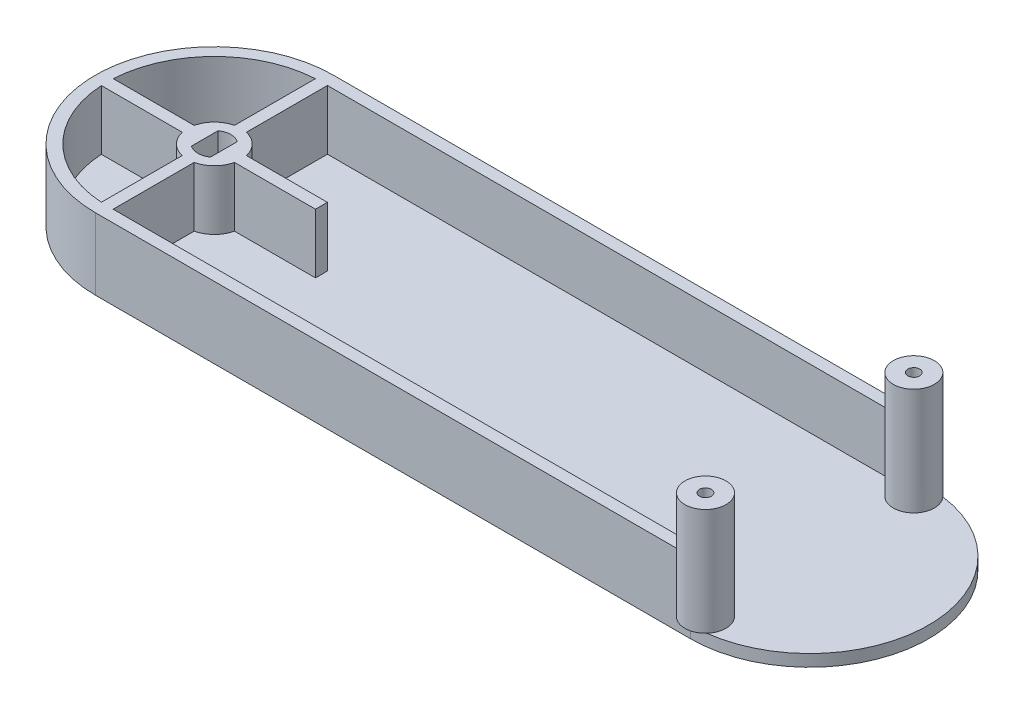
ISO-10303-21;
HEADER;
FILE_DESCRIPTION(('STEP AP214'),'2;1');
FILE_NAME('part.step','',(''),(''),'','','');
FILE_SCHEMA(('AUTOMOTIVE_DESIGN { 1 0 10303 214 1 1 1 1 }'));
ENDSEC;
DATA;
#1=APPLICATION_CONTEXT('core data for automotive mechanical design processes');
#2=APPLICATION_PROTOCOL_DEFINITION('international standard','automotive_design',2000,#1);
#3=PRODUCT_CONTEXT('',#1,'mechanical');
#4=PRODUCT('Part','Part','',(#3));
#5=PRODUCT_RELATED_PRODUCT_CATEGORY('part','',(#4));
#6=PRODUCT_DEFINITION_FORMATION('','',#4);
#7=PRODUCT_DEFINITION_CONTEXT('part definition',#1,'design');
#8=PRODUCT_DEFINITION('design','',#6,#7);
#9=PRODUCT_DEFINITION_SHAPE('','',#8);
#10=(LENGTH_UNIT() NAMED_UNIT(*) SI_UNIT(.MILLI.,.METRE.));
#11=(NAMED_UNIT(*) PLANE_ANGLE_UNIT() SI_UNIT($,.RADIAN.));
#12=(NAMED_UNIT(*) SI_UNIT($,.STERADIAN.) SOLID_ANGLE_UNIT());
#13=UNCERTAINTY_MEASURE_WITH_UNIT(LENGTH_MEASURE(1.E-05),#10,'distance_accuracy_value','');
#14=(GEOMETRIC_REPRESENTATION_CONTEXT(3) GLOBAL_UNCERTAINTY_ASSIGNED_CONTEXT((#13)) GLOBAL_UNIT_ASSIGNED_CONTEXT((#10,
#11,#12)) REPRESENTATION_CONTEXT('',''));
#15=CARTESIAN_POINT('',(0.,0.,0.));
#16=DIRECTION('',(0.,0.,1.));
#17=DIRECTION('',(1.,0.,0.));
#18=AXIS2_PLACEMENT_3D('',#15,#16,#17);
#19=CARTESIAN_POINT('',(-50.,12.,20.));
#20=DIRECTION('',(0.,0.,-1.));
#21=DIRECTION('',(-1.,0.,0.));
#22=AXIS2_PLACEMENT_3D('',#19,#20,#21);
#23=PLANE('',#22);
#24=DIRECTION('',(1.,0.,0.));
#25=VECTOR('',#24,1.);
#26=CARTESIAN_POINT('',(-50.,2.,20.));
#27=LINE('',#26,#25);
#28=CARTESIAN_POINT('',(47.6225013144062,2.,20.));
#29=VERTEX_POINT('',#28);
#30=CARTESIAN_POINT('',(50.,2.,20.));
#31=VERTEX_POINT('',#30);
#32=EDGE_CURVE('E246',#29,#31,#27,.T.);
#33=ORIENTED_EDGE('',*,*,#32,.F.);
#34=DIRECTION('',(0.,-1.,0.));
#35=VECTOR('',#34,1.);
#36=CARTESIAN_POINT('',(47.6225013144062,20.,20.));
#37=LINE('',#36,#35);
#38=CARTESIAN_POINT('',(47.6225013144062,12.,20.));
#39=VERTEX_POINT('',#38);
#40=EDGE_CURVE('E253',#39,#29,#37,.T.);
#41=ORIENTED_EDGE('',*,*,#40,.F.);
#42=DIRECTION('',(1.,0.,0.));
#43=VECTOR('',#42,1.);
#44=CARTESIAN_POINT('',(-50.,12.,20.));
#45=LINE('',#44,#43);
#46=CARTESIAN_POINT('',(-50.,12.,20.));
#47=VERTEX_POINT('',#46);
#48=EDGE_CURVE('E422',#47,#39,#45,.T.);
#49=ORIENTED_EDGE('',*,*,#48,.F.);
#50=DIRECTION('',(0.,-1.,0.));
#51=VECTOR('',#50,1.);
#52=CARTESIAN_POINT('',(-50.,12.,20.));
#53=LINE('',#52,#51);
#54=CARTESIAN_POINT('',(-50.,0.,20.));
#55=VERTEX_POINT('',#54);
#56=EDGE_CURVE('E444',#47,#55,#53,.T.);
#57=ORIENTED_EDGE('',*,*,#56,.T.);
#58=DIRECTION('',(1.,0.,0.));
#59=VECTOR('',#58,1.);
#60=CARTESIAN_POINT('',(-50.,0.,20.));
#61=LINE('',#60,#59);
#62=CARTESIAN_POINT('',(50.,0.,20.));
#63=VERTEX_POINT('',#62);
#64=EDGE_CURVE('E431',#55,#63,#61,.T.);
#65=ORIENTED_EDGE('',*,*,#64,.T.);
#66=DIRECTION('',(0.,-1.,0.));
#67=VECTOR('',#66,1.);
#68=CARTESIAN_POINT('',(50.,12.,20.));
#69=LINE('',#68,#67);
#70=EDGE_CURVE('E442',#31,#63,#69,.T.);
#71=ORIENTED_EDGE('',*,*,#70,.F.);
#72=EDGE_LOOP('',(#33,#41,#49,#57,#65,#71));
#73=FACE_BOUND('',#72,.T.);
#74=ADVANCED_FACE('F51',(#73),#23,.F.);
#75=CARTESIAN_POINT('',(-50.,12.,18.));
#76=DIRECTION('',(0.,0.,-1.));
#77=DIRECTION('',(-1.,0.,0.));
#78=AXIS2_PLACEMENT_3D('',#75,#76,#77);
#79=PLANE('',#78);
#80=DIRECTION('',(1.,0.,0.));
#81=VECTOR('',#80,1.);
#82=CARTESIAN_POINT('',(-50.,12.,18.));
#83=LINE('',#82,#81);
#84=CARTESIAN_POINT('',(-49.,12.,18.));
#85=VERTEX_POINT('',#84);
#86=CARTESIAN_POINT('',(46.5864241622603,12.,18.));
#87=VERTEX_POINT('',#86);
#88=EDGE_CURVE('E413',#85,#87,#83,.T.);
#89=ORIENTED_EDGE('',*,*,#88,.T.);
#90=DIRECTION('',(0.,-1.,0.));
#91=VECTOR('',#90,1.);
#92=CARTESIAN_POINT('',(46.5864241622603,20.,18.));
#93=LINE('',#92,#91);
#94=CARTESIAN_POINT('',(46.5864241622603,2.,18.));
#95=VERTEX_POINT('',#94);
#96=EDGE_CURVE('E12',#87,#95,#93,.T.);
#97=ORIENTED_EDGE('',*,*,#96,.T.);
#98=DIRECTION('',(1.,0.,0.));
#99=VECTOR('',#98,1.);
#100=CARTESIAN_POINT('',(-50.,2.,18.));
#101=LINE('',#100,#99);
#102=CARTESIAN_POINT('',(-48.9999999999999,2.,18.));
#103=VERTEX_POINT('',#102);
#104=EDGE_CURVE('E259',#103,#95,#101,.T.);
#105=ORIENTED_EDGE('',*,*,#104,.F.);
#106=DIRECTION('',(0.,-1.,0.));
#107=VECTOR('',#106,1.);
#108=CARTESIAN_POINT('',(-49.,12.,18.));
#109=LINE('',#108,#107);
#110=EDGE_CURVE('E311',#85,#103,#109,.T.);
#111=ORIENTED_EDGE('',*,*,#110,.F.);
#112=EDGE_LOOP('',(#89,#97,#105,#111));
#113=FACE_BOUND('',#112,.T.);
#114=ADVANCED_FACE('F547',(#113),#79,.T.);
#115=CARTESIAN_POINT('',(50.,12.,0.));
#116=DIRECTION('',(0.,-1.,0.));
#117=DIRECTION('',(0.,0.,-1.));
#118=AXIS2_PLACEMENT_3D('',#115,#116,#117);
#119=CYLINDRICAL_SURFACE('',#118,20.);
#120=CARTESIAN_POINT('',(50.,2.,0.));
#121=DIRECTION('',(0.,1.,0.));
#122=DIRECTION('',(0.,0.,1.));
#123=AXIS2_PLACEMENT_3D('',#120,#121,#122);
#124=CIRCLE('',#123,20.);
#125=CARTESIAN_POINT('',(52.5365168538766,2.,19.8385));
#126=VERTEX_POINT('',#125);
#127=EDGE_CURVE('E242',#31,#126,#124,.T.);
#128=ORIENTED_EDGE('',*,*,#127,.F.);
#129=ORIENTED_EDGE('',*,*,#70,.T.);
#130=CARTESIAN_POINT('',(50.,0.,0.));
#131=DIRECTION('',(0.,1.,0.));
#132=DIRECTION('',(0.,0.,1.));
#133=AXIS2_PLACEMENT_3D('',#130,#131,#132);
#134=CIRCLE('',#133,20.);
#135=CARTESIAN_POINT('',(50.,0.,-20.));
#136=VERTEX_POINT('',#135);
#137=EDGE_CURVE('E434',#63,#136,#134,.T.);
#138=ORIENTED_EDGE('',*,*,#137,.T.);
#139=DIRECTION('',(0.,-1.,0.));
#140=VECTOR('',#139,1.);
#141=CARTESIAN_POINT('',(50.,12.,-20.));
#142=LINE('',#141,#140);
#143=CARTESIAN_POINT('',(50.,2.,-20.));
#144=VERTEX_POINT('',#143);
#145=EDGE_CURVE('E440',#144,#136,#142,.T.);
#146=ORIENTED_EDGE('',*,*,#145,.F.);
#147=CARTESIAN_POINT('',(50.,2.,0.));
#148=DIRECTION('',(0.,-1.,0.));
#149=DIRECTION('',(0.,0.,-1.));
#150=AXIS2_PLACEMENT_3D('',#147,#148,#149);
#151=CIRCLE('',#150,20.);
#152=CARTESIAN_POINT('',(52.5365168538766,2.,-19.8385));
#153=VERTEX_POINT('',#152);
#154=EDGE_CURVE('E264',#144,#153,#151,.T.);
#155=ORIENTED_EDGE('',*,*,#154,.T.);
#156=EDGE_CURVE('E72',#126,#153,#124,.T.);
#157=ORIENTED_EDGE('',*,*,#156,.F.);
#158=EDGE_LOOP('',(#128,#129,#138,#146,#155,#157));
#159=FACE_BOUND('',#158,.T.);
#160=ADVANCED_FACE('F261',(#159),#119,.T.);
#161=CARTESIAN_POINT('',(-50.,2.,0.));
#162=DIRECTION('',(0.,1.,0.));
#163=DIRECTION('',(0.,0.,1.));
#164=AXIS2_PLACEMENT_3D('',#161,#162,#163);
#165=PLANE('',#164);
#166=CARTESIAN_POINT('',(-50.,2.,0.));
#167=DIRECTION('',(0.,1.,0.));
#168=DIRECTION('',(0.,0.,1.));
#169=AXIS2_PLACEMENT_3D('',#166,#167,#168);
#170=CIRCLE('',#169,18.);
#171=CARTESIAN_POINT('',(-51.,2.,-17.9722007556114));
#172=VERTEX_POINT('',#171);
#173=CARTESIAN_POINT('',(-67.9722007556114,2.,-1.00000000000015));
#174=VERTEX_POINT('',#173);
#175=EDGE_CURVE('E404',#172,#174,#170,.T.);
#176=ORIENTED_EDGE('',*,*,#175,.T.);
#177=DIRECTION('',(-1.,0.,0.));
#178=VECTOR('',#177,1.);
#179=CARTESIAN_POINT('',(0.,2.,-0.999999999999426));
#180=LINE('',#179,#178);
#181=CARTESIAN_POINT('',(-54.3874821936961,2.,-1.));
#182=VERTEX_POINT('',#181);
#183=EDGE_CURVE('E249',#182,#174,#180,.T.);
#184=ORIENTED_EDGE('',*,*,#183,.F.);
#185=CARTESIAN_POINT('',(-50.,2.,0.));
#186=DIRECTION('',(0.,1.,0.));
#187=DIRECTION('',(0.,0.,1.));
#188=AXIS2_PLACEMENT_3D('',#185,#186,#187);
#189=CIRCLE('',#188,4.5);
#190=CARTESIAN_POINT('',(-51.,2.,-4.38748219369606));
#191=VERTEX_POINT('',#190);
#192=EDGE_CURVE('E367',#191,#182,#189,.T.);
#193=ORIENTED_EDGE('',*,*,#192,.F.);
#194=DIRECTION('',(0.,0.,-1.));
#195=VECTOR('',#194,1.);
#196=CARTESIAN_POINT('',(-51.,2.,0.));
#197=LINE('',#196,#195);
#198=EDGE_CURVE('E346',#191,#172,#197,.T.);
#199=ORIENTED_EDGE('',*,*,#198,.T.);
#200=EDGE_LOOP('',(#176,#184,#193,#199));
#201=FACE_BOUND('',#200,.T.);
#202=ADVANCED_FACE('F554',(#201),#165,.T.);
#203=CARTESIAN_POINT('',(-50.,12.,0.));
#204=DIRECTION('',(0.,-1.,0.));
#205=DIRECTION('',(0.,0.,-1.));
#206=AXIS2_PLACEMENT_3D('',#203,#204,#205);
#207=CYLINDRICAL_SURFACE('',#206,4.5);
#208=DIRECTION('',(0.,-1.,0.));
#209=VECTOR('',#208,1.);
#210=CARTESIAN_POINT('',(-54.3874821936961,12.,-1.));
#211=LINE('',#210,#209);
#212=CARTESIAN_POINT('',(-54.3874821936961,12.,-1.));
#213=VERTEX_POINT('',#212);
#214=EDGE_CURVE('E289',#213,#182,#211,.T.);
#215=ORIENTED_EDGE('',*,*,#214,.F.);
#216=CARTESIAN_POINT('',(-50.,12.,0.));
#217=DIRECTION('',(0.,1.,0.));
#218=DIRECTION('',(0.,0.,1.));
#219=AXIS2_PLACEMENT_3D('',#216,#217,#218);
#220=CIRCLE('',#219,4.5);
#221=CARTESIAN_POINT('',(-51.,12.,-4.38748219369606));
#222=VERTEX_POINT('',#221);
#223=EDGE_CURVE('E374',#222,#213,#220,.T.);
#224=ORIENTED_EDGE('',*,*,#223,.F.);
#225=DIRECTION('',(0.,-1.,0.));
#226=VECTOR('',#225,1.);
#227=CARTESIAN_POINT('',(-51.,12.,-4.38748219369606));
#228=LINE('',#227,#226);
#229=EDGE_CURVE('E355',#222,#191,#228,.T.);
#230=ORIENTED_EDGE('',*,*,#229,.T.);
#231=ORIENTED_EDGE('',*,*,#192,.T.);
#232=EDGE_LOOP('',(#215,#224,#230,#231));
#233=FACE_BOUND('',#232,.T.);
#234=ADVANCED_FACE('F580',(#233),#207,.T.);
#235=CARTESIAN_POINT('',(-50.,12.,0.));
#236=DIRECTION('',(0.,-1.,0.));
#237=DIRECTION('',(0.,0.,-1.));
#238=AXIS2_PLACEMENT_3D('',#235,#236,#237);
#239=CYLINDRICAL_SURFACE('',#238,18.);
#240=CARTESIAN_POINT('',(-50.,12.,0.));
#241=DIRECTION('',(0.,1.,0.));
#242=DIRECTION('',(0.,0.,1.));
#243=AXIS2_PLACEMENT_3D('',#240,#241,#242);
#244=CIRCLE('',#243,18.);
#245=CARTESIAN_POINT('',(-51.,12.,-17.9722007556114));
#246=VERTEX_POINT('',#245);
#247=CARTESIAN_POINT('',(-67.9722007556114,12.,-1.00000000000015));
#248=VERTEX_POINT('',#247);
#249=EDGE_CURVE('E411',#246,#248,#244,.T.);
#250=ORIENTED_EDGE('',*,*,#249,.T.);
#251=DIRECTION('',(0.,-1.,0.));
#252=VECTOR('',#251,1.);
#253=CARTESIAN_POINT('',(-67.9722007556114,12.,-1.00000000000015));
#254=LINE('',#253,#252);
#255=EDGE_CURVE('E287',#248,#174,#254,.T.);
#256=ORIENTED_EDGE('',*,*,#255,.T.);
#257=ORIENTED_EDGE('',*,*,#175,.F.);
#258=DIRECTION('',(0.,-1.,0.));
#259=VECTOR('',#258,1.);
#260=CARTESIAN_POINT('',(-51.,12.,-17.9722007556114));
#261=LINE('',#260,#259);
#262=EDGE_CURVE('E361',#246,#172,#261,.T.);
#263=ORIENTED_EDGE('',*,*,#262,.F.);
#264=EDGE_LOOP('',(#250,#256,#257,#263));
#265=FACE_BOUND('',#264,.T.);
#266=ADVANCED_FACE('F586',(#265),#239,.F.);
#267=DIRECTION('',(-1.,0.,0.));
#268=VECTOR('',#267,1.);
#269=CARTESIAN_POINT('',(0.,2.,1.00000000000058));
#270=LINE('',#269,#268);
#271=CARTESIAN_POINT('',(-54.3874821936961,2.,1.));
#272=VERTEX_POINT('',#271);
#273=CARTESIAN_POINT('',(-67.9722007556114,2.,0.999999999999855));
#274=VERTEX_POINT('',#273);
#275=EDGE_CURVE('E276',#272,#274,#270,.T.);
#276=ORIENTED_EDGE('',*,*,#275,.T.);
#277=CARTESIAN_POINT('',(-51.,2.,17.9722007556114));
#278=VERTEX_POINT('',#277);
#279=EDGE_CURVE('E400',#274,#278,#170,.T.);
#280=ORIENTED_EDGE('',*,*,#279,.T.);
#281=DIRECTION('',(0.,0.,1.));
#282=VECTOR('',#281,1.);
#283=CARTESIAN_POINT('',(-50.9999999999999,2.,-3.60178889026383E-13));
#284=LINE('',#283,#282);
#285=CARTESIAN_POINT('',(-50.9999999999999,2.,4.38748219369608));
#286=VERTEX_POINT('',#285);
#287=EDGE_CURVE('E297',#286,#278,#284,.T.);
#288=ORIENTED_EDGE('',*,*,#287,.F.);
#289=EDGE_CURVE('E387',#272,#286,#189,.T.);
#290=ORIENTED_EDGE('',*,*,#289,.F.);
#291=EDGE_LOOP('',(#276,#280,#288,#290));
#292=FACE_BOUND('',#291,.T.);
#293=ADVANCED_FACE('F516',(#292),#165,.T.);
#294=CARTESIAN_POINT('',(-54.3874821936961,12.,0.999999999999999));
#295=VERTEX_POINT('',#294);
#296=CARTESIAN_POINT('',(-50.9999999999999,12.,4.38748219369608));
#297=VERTEX_POINT('',#296);
#298=EDGE_CURVE('E378',#295,#297,#220,.T.);
#299=ORIENTED_EDGE('',*,*,#298,.F.);
#300=DIRECTION('',(0.,-1.,0.));
#301=VECTOR('',#300,1.);
#302=CARTESIAN_POINT('',(-54.3874821936961,12.,0.999999999999999));
#303=LINE('',#302,#301);
#304=EDGE_CURVE('E279',#295,#272,#303,.T.);
#305=ORIENTED_EDGE('',*,*,#304,.T.);
#306=ORIENTED_EDGE('',*,*,#289,.T.);
#307=DIRECTION('',(0.,-1.,0.));
#308=VECTOR('',#307,1.);
#309=CARTESIAN_POINT('',(-50.9999999999999,12.,4.38748219369608));
#310=LINE('',#309,#308);
#311=EDGE_CURVE('E306',#297,#286,#310,.T.);
#312=ORIENTED_EDGE('',*,*,#311,.F.);
#313=EDGE_LOOP('',(#299,#305,#306,#312));
#314=FACE_BOUND('',#313,.T.);
#315=ADVANCED_FACE('F511',(#314),#207,.T.);
#316=DIRECTION('',(0.,-1.,0.));
#317=VECTOR('',#316,1.);
#318=CARTESIAN_POINT('',(-67.9722007556114,12.,0.999999999999855));
#319=LINE('',#318,#317);
#320=CARTESIAN_POINT('',(-67.9722007556114,12.,0.999999999999855));
#321=VERTEX_POINT('',#320);
#322=EDGE_CURVE('E284',#321,#274,#319,.T.);
#323=ORIENTED_EDGE('',*,*,#322,.F.);
#324=CARTESIAN_POINT('',(-51.,12.,17.9722007556114));
#325=VERTEX_POINT('',#324);
#326=EDGE_CURVE('E410',#321,#325,#244,.T.);
#327=ORIENTED_EDGE('',*,*,#326,.T.);
#328=DIRECTION('',(0.,-1.,0.));
#329=VECTOR('',#328,1.);
#330=CARTESIAN_POINT('',(-51.,12.,17.9722007556114));
#331=LINE('',#330,#329);
#332=EDGE_CURVE('E300',#325,#278,#331,.T.);
#333=ORIENTED_EDGE('',*,*,#332,.T.);
#334=ORIENTED_EDGE('',*,*,#279,.F.);
#335=EDGE_LOOP('',(#323,#327,#333,#334));
#336=FACE_BOUND('',#335,.T.);
#337=ADVANCED_FACE('F558',(#336),#239,.F.);
#338=ORIENTED_EDGE('',*,*,#104,.T.);
#339=CARTESIAN_POINT('',(50.,2.,17.5));
#340=DIRECTION('',(0.,1.,0.));
#341=DIRECTION('',(0.,0.,1.));
#342=AXIS2_PLACEMENT_3D('',#339,#340,#341);
#343=CIRCLE('',#342,3.45);
#344=EDGE_CURVE('E66',#126,#95,#343,.T.);
#345=ORIENTED_EDGE('',*,*,#344,.F.);
#346=ORIENTED_EDGE('',*,*,#156,.T.);
#347=CARTESIAN_POINT('',(50.,2.,-17.5));
#348=DIRECTION('',(0.,-1.,0.));
#349=DIRECTION('',(0.,0.,-1.));
#350=AXIS2_PLACEMENT_3D('',#347,#348,#349);
#351=CIRCLE('',#350,3.45);
#352=CARTESIAN_POINT('',(46.5864241622603,2.,-18.));
#353=VERTEX_POINT('',#352);
#354=EDGE_CURVE('E485',#153,#353,#351,.T.);
#355=ORIENTED_EDGE('',*,*,#354,.T.);
#356=DIRECTION('',(-1.,0.,0.));
#357=VECTOR('',#356,1.);
#358=CARTESIAN_POINT('',(-50.,2.,-18.));
#359=LINE('',#358,#357);
#360=CARTESIAN_POINT('',(-49.,2.,-18.));
#361=VERTEX_POINT('',#360);
#362=EDGE_CURVE('E408',#353,#361,#359,.T.);
#363=ORIENTED_EDGE('',*,*,#362,.T.);
#364=DIRECTION('',(0.,0.,-1.));
#365=VECTOR('',#364,1.);
#366=CARTESIAN_POINT('',(-49.,2.,0.));
#367=LINE('',#366,#365);
#368=CARTESIAN_POINT('',(-49.,2.,-4.38748219369606));
#369=VERTEX_POINT('',#368);
#370=EDGE_CURVE('E341',#369,#361,#367,.T.);
#371=ORIENTED_EDGE('',*,*,#370,.F.);
#372=CARTESIAN_POINT('',(-45.612517806304,2.,-1.00000000000006));
#373=VERTEX_POINT('',#372);
#374=EDGE_CURVE('E384',#373,#369,#189,.T.);
#375=ORIENTED_EDGE('',*,*,#374,.F.);
#376=DIRECTION('',(1.,0.,0.));
#377=VECTOR('',#376,1.);
#378=CARTESIAN_POINT('',(0.,2.,-0.999999999999902));
#379=LINE('',#378,#377);
#380=CARTESIAN_POINT('',(-32.0277992443886,2.,-1.00000000000001));
#381=VERTEX_POINT('',#380);
#382=EDGE_CURVE('E319',#373,#381,#379,.T.);
#383=ORIENTED_EDGE('',*,*,#382,.T.);
#384=CARTESIAN_POINT('',(-50.,2.,0.));
#385=DIRECTION('',(0.,1.,0.));
#386=DIRECTION('',(0.,0.,1.));
#387=AXIS2_PLACEMENT_3D('',#384,#385,#386);
#388=CIRCLE('',#387,18.);
#389=CARTESIAN_POINT('',(-32.0277992443886,2.,0.999999999999987));
#390=VERTEX_POINT('',#389);
#391=EDGE_CURVE('E327',#390,#381,#388,.T.);
#392=ORIENTED_EDGE('',*,*,#391,.F.);
#393=DIRECTION('',(1.,0.,0.));
#394=VECTOR('',#393,1.);
#395=CARTESIAN_POINT('',(0.,2.,1.0000000000001));
#396=LINE('',#395,#394);
#397=CARTESIAN_POINT('',(-45.6125178063039,2.,0.999999999999939));
#398=VERTEX_POINT('',#397);
#399=EDGE_CURVE('E314',#398,#390,#396,.T.);
#400=ORIENTED_EDGE('',*,*,#399,.F.);
#401=CARTESIAN_POINT('',(-48.9999999999999,2.,4.38748219369604));
#402=VERTEX_POINT('',#401);
#403=EDGE_CURVE('E503',#402,#398,#189,.T.);
#404=ORIENTED_EDGE('',*,*,#403,.F.);
#405=DIRECTION('',(0.,0.,1.));
#406=VECTOR('',#405,1.);
#407=CARTESIAN_POINT('',(-48.9999999999999,2.,-3.46054226711623E-13));
#408=LINE('',#407,#406);
#409=EDGE_CURVE('E292',#402,#103,#408,.T.);
#410=ORIENTED_EDGE('',*,*,#409,.T.);
#411=EDGE_LOOP('',(#338,#345,#346,#355,#363,#371,#375,#383,#392,#400,#404,#410));
#412=FACE_BOUND('',#411,.T.);
#413=ADVANCED_FACE('F257',(#412),#165,.T.);
#414=CARTESIAN_POINT('',(-48.9999999999999,12.,4.38748219369604));
#415=VERTEX_POINT('',#414);
#416=CARTESIAN_POINT('',(-45.6125178063039,12.,0.999999999999939));
#417=VERTEX_POINT('',#416);
#418=EDGE_CURVE('E525',#415,#417,#220,.T.);
#419=ORIENTED_EDGE('',*,*,#418,.F.);
#420=DIRECTION('',(0.,-1.,0.));
#421=VECTOR('',#420,1.);
#422=CARTESIAN_POINT('',(-48.9999999999999,12.,4.38748219369604));
#423=LINE('',#422,#421);
#424=EDGE_CURVE('E309',#415,#402,#423,.T.);
#425=ORIENTED_EDGE('',*,*,#424,.T.);
#426=ORIENTED_EDGE('',*,*,#403,.T.);
#427=DIRECTION('',(0.,-1.,0.));
#428=VECTOR('',#427,1.);
#429=CARTESIAN_POINT('',(-45.6125178063039,12.,0.999999999999939));
#430=LINE('',#429,#428);
#431=EDGE_CURVE('E324',#417,#398,#430,.T.);
#432=ORIENTED_EDGE('',*,*,#431,.F.);
#433=EDGE_LOOP('',(#419,#425,#426,#432));
#434=FACE_BOUND('',#433,.T.);
#435=ADVANCED_FACE('F541',(#434),#207,.T.);
#436=CARTESIAN_POINT('',(-50.,12.,-18.));
#437=DIRECTION('',(0.,0.,1.));
#438=DIRECTION('',(1.,0.,0.));
#439=AXIS2_PLACEMENT_3D('',#436,#437,#438);
#440=PLANE('',#439);
#441=DIRECTION('',(0.,-1.,0.));
#442=VECTOR('',#441,1.);
#443=CARTESIAN_POINT('',(46.5864241622604,20.,-18.));
#444=LINE('',#443,#442);
#445=CARTESIAN_POINT('',(46.5864241622604,12.,-18.));
#446=VERTEX_POINT('',#445);
#447=EDGE_CURVE('E266',#446,#353,#444,.T.);
#448=ORIENTED_EDGE('',*,*,#447,.F.);
#449=DIRECTION('',(-1.,0.,0.));
#450=VECTOR('',#449,1.);
#451=CARTESIAN_POINT('',(-50.,12.,-18.));
#452=LINE('',#451,#450);
#453=CARTESIAN_POINT('',(-49.,12.,-18.));
#454=VERTEX_POINT('',#453);
#455=EDGE_CURVE('E416',#446,#454,#452,.T.);
#456=ORIENTED_EDGE('',*,*,#455,.T.);
#457=DIRECTION('',(0.,-1.,0.));
#458=VECTOR('',#457,1.);
#459=CARTESIAN_POINT('',(-49.,12.,-18.));
#460=LINE('',#459,#458);
#461=EDGE_CURVE('E358',#454,#361,#460,.T.);
#462=ORIENTED_EDGE('',*,*,#461,.T.);
#463=ORIENTED_EDGE('',*,*,#362,.F.);
#464=EDGE_LOOP('',(#448,#456,#462,#463));
#465=FACE_BOUND('',#464,.T.);
#466=ADVANCED_FACE('F494',(#465),#440,.T.);
#467=CARTESIAN_POINT('',(-45.612517806304,12.,-1.00000000000006));
#468=VERTEX_POINT('',#467);
#469=CARTESIAN_POINT('',(-49.,12.,-4.38748219369606));
#470=VERTEX_POINT('',#469);
#471=EDGE_CURVE('E373',#468,#470,#220,.T.);
#472=ORIENTED_EDGE('',*,*,#471,.F.);
#473=DIRECTION('',(0.,-1.,0.));
#474=VECTOR('',#473,1.);
#475=CARTESIAN_POINT('',(-45.612517806304,12.,-1.00000000000006));
#476=LINE('',#475,#474);
#477=EDGE_CURVE('E334',#468,#373,#476,.T.);
#478=ORIENTED_EDGE('',*,*,#477,.T.);
#479=ORIENTED_EDGE('',*,*,#374,.T.);
#480=DIRECTION('',(0.,-1.,0.));
#481=VECTOR('',#480,1.);
#482=CARTESIAN_POINT('',(-49.,12.,-4.38748219369606));
#483=LINE('',#482,#481);
#484=EDGE_CURVE('E348',#470,#369,#483,.T.);
#485=ORIENTED_EDGE('',*,*,#484,.F.);
#486=EDGE_LOOP('',(#472,#478,#479,#485));
#487=FACE_BOUND('',#486,.T.);
#488=ADVANCED_FACE('F530',(#487),#207,.T.);
#489=CARTESIAN_POINT('',(-50.,12.,0.));
#490=DIRECTION('',(0.,-1.,0.));
#491=DIRECTION('',(0.,0.,-1.));
#492=AXIS2_PLACEMENT_3D('',#489,#490,#491);
#493=CYLINDRICAL_SURFACE('',#492,20.);
#494=CARTESIAN_POINT('',(-50.,0.,0.));
#495=DIRECTION('',(0.,1.,0.));
#496=DIRECTION('',(0.,0.,1.));
#497=AXIS2_PLACEMENT_3D('',#494,#495,#496);
#498=CIRCLE('',#497,20.);
#499=CARTESIAN_POINT('',(-50.,0.,-20.));
#500=VERTEX_POINT('',#499);
#501=EDGE_CURVE('E418',#500,#55,#498,.T.);
#502=ORIENTED_EDGE('',*,*,#501,.T.);
#503=ORIENTED_EDGE('',*,*,#56,.F.);
#504=CARTESIAN_POINT('',(-50.,12.,0.));
#505=DIRECTION('',(0.,1.,0.));
#506=DIRECTION('',(0.,0.,1.));
#507=AXIS2_PLACEMENT_3D('',#504,#505,#506);
#508=CIRCLE('',#507,20.);
#509=CARTESIAN_POINT('',(-50.,12.,-20.));
#510=VERTEX_POINT('',#509);
#511=EDGE_CURVE('E419',#510,#47,#508,.T.);
#512=ORIENTED_EDGE('',*,*,#511,.F.);
#513=DIRECTION('',(0.,-1.,0.));
#514=VECTOR('',#513,1.);
#515=CARTESIAN_POINT('',(-50.,12.,-20.));
#516=LINE('',#515,#514);
#517=EDGE_CURVE('E428',#510,#500,#516,.T.);
#518=ORIENTED_EDGE('',*,*,#517,.T.);
#519=EDGE_LOOP('',(#502,#503,#512,#518));
#520=FACE_BOUND('',#519,.T.);
#521=ADVANCED_FACE('F53',(#520),#493,.T.);
#522=CARTESIAN_POINT('',(-50.,12.,-20.));
#523=DIRECTION('',(0.,0.,1.));
#524=DIRECTION('',(1.,0.,0.));
#525=AXIS2_PLACEMENT_3D('',#522,#523,#524);
#526=PLANE('',#525);
#527=DIRECTION('',(-1.,0.,0.));
#528=VECTOR('',#527,1.);
#529=CARTESIAN_POINT('',(-50.,12.,-20.));
#530=LINE('',#529,#528);
#531=CARTESIAN_POINT('',(47.6225013144063,12.,-20.));
#532=VERTEX_POINT('',#531);
#533=EDGE_CURVE('E426',#532,#510,#530,.T.);
#534=ORIENTED_EDGE('',*,*,#533,.F.);
#535=DIRECTION('',(0.,-1.,0.));
#536=VECTOR('',#535,1.);
#537=CARTESIAN_POINT('',(47.6225013144063,20.,-20.));
#538=LINE('',#537,#536);
#539=CARTESIAN_POINT('',(47.6225013144063,2.,-20.));
#540=VERTEX_POINT('',#539);
#541=EDGE_CURVE('E268',#532,#540,#538,.T.);
#542=ORIENTED_EDGE('',*,*,#541,.T.);
#543=DIRECTION('',(1.,0.,0.));
#544=VECTOR('',#543,1.);
#545=CARTESIAN_POINT('',(-50.,2.,-20.));
#546=LINE('',#545,#544);
#547=EDGE_CURVE('E484',#540,#144,#546,.T.);
#548=ORIENTED_EDGE('',*,*,#547,.T.);
#549=ORIENTED_EDGE('',*,*,#145,.T.);
#550=DIRECTION('',(-1.,0.,0.));
#551=VECTOR('',#550,1.);
#552=CARTESIAN_POINT('',(-50.,0.,-20.));
#553=LINE('',#552,#551);
#554=EDGE_CURVE('E423',#136,#500,#553,.T.);
#555=ORIENTED_EDGE('',*,*,#554,.T.);
#556=ORIENTED_EDGE('',*,*,#517,.F.);
#557=EDGE_LOOP('',(#534,#542,#548,#549,#555,#556));
#558=FACE_BOUND('',#557,.T.);
#559=ADVANCED_FACE('F460',(#558),#526,.F.);
#560=CARTESIAN_POINT('',(-50.,12.,0.));
#561=DIRECTION('',(0.,1.,0.));
#562=DIRECTION('',(0.,0.,1.));
#563=AXIS2_PLACEMENT_3D('',#560,#561,#562);
#564=PLANE('',#563);
#565=ORIENTED_EDGE('',*,*,#48,.T.);
#566=CARTESIAN_POINT('',(50.,12.,17.5));
#567=DIRECTION('',(0.,1.,0.));
#568=DIRECTION('',(0.,0.,1.));
#569=AXIS2_PLACEMENT_3D('',#566,#567,#568);
#570=CIRCLE('',#569,3.45);
#571=EDGE_CURVE('E468',#39,#87,#570,.F.);
#572=ORIENTED_EDGE('',*,*,#571,.T.);
#573=ORIENTED_EDGE('',*,*,#88,.F.);
#574=DIRECTION('',(0.,0.,1.));
#575=VECTOR('',#574,1.);
#576=CARTESIAN_POINT('',(-48.9999999999999,12.,-3.46054226711623E-13));
#577=LINE('',#576,#575);
#578=EDGE_CURVE('E293',#415,#85,#577,.T.);
#579=ORIENTED_EDGE('',*,*,#578,.F.);
#580=ORIENTED_EDGE('',*,*,#418,.T.);
#581=DIRECTION('',(1.,0.,0.));
#582=VECTOR('',#581,1.);
#583=CARTESIAN_POINT('',(0.,12.,1.0000000000001));
#584=LINE('',#583,#582);
#585=CARTESIAN_POINT('',(-32.0277992443886,12.,0.999999999999987));
#586=VERTEX_POINT('',#585);
#587=EDGE_CURVE('E315',#417,#586,#584,.T.);
#588=ORIENTED_EDGE('',*,*,#587,.T.);
#589=CARTESIAN_POINT('',(-50.,12.,0.));
#590=DIRECTION('',(0.,1.,0.));
#591=DIRECTION('',(0.,0.,1.));
#592=AXIS2_PLACEMENT_3D('',#589,#590,#591);
#593=CIRCLE('',#592,18.);
#594=CARTESIAN_POINT('',(-32.0277992443886,12.,-1.00000000000001));
#595=VERTEX_POINT('',#594);
#596=EDGE_CURVE('E318',#586,#595,#593,.T.);
#597=ORIENTED_EDGE('',*,*,#596,.T.);
#598=DIRECTION('',(1.,0.,0.));
#599=VECTOR('',#598,1.);
#600=CARTESIAN_POINT('',(0.,12.,-0.999999999999902));
#601=LINE('',#600,#599);
#602=EDGE_CURVE('E321',#468,#595,#601,.T.);
#603=ORIENTED_EDGE('',*,*,#602,.F.);
#604=ORIENTED_EDGE('',*,*,#471,.T.);
#605=DIRECTION('',(0.,0.,-1.));
#606=VECTOR('',#605,1.);
#607=CARTESIAN_POINT('',(-49.,12.,0.));
#608=LINE('',#607,#606);
#609=EDGE_CURVE('E342',#470,#454,#608,.T.);
#610=ORIENTED_EDGE('',*,*,#609,.T.);
#611=ORIENTED_EDGE('',*,*,#455,.F.);
#612=CARTESIAN_POINT('',(50.,12.,-17.5));
#613=DIRECTION('',(0.,1.,0.));
#614=DIRECTION('',(0.,0.,1.));
#615=AXIS2_PLACEMENT_3D('',#612,#613,#614);
#616=CIRCLE('',#615,3.45);
#617=EDGE_CURVE('E59',#532,#446,#616,.T.);
#618=ORIENTED_EDGE('',*,*,#617,.F.);
#619=ORIENTED_EDGE('',*,*,#533,.T.);
#620=ORIENTED_EDGE('',*,*,#511,.T.);
#621=EDGE_LOOP('',(#565,#572,#573,#579,#580,#588,#597,#603,#604,#610,#611,#618,#619,#620));
#622=FACE_BOUND('',#621,.T.);
#623=ORIENTED_EDGE('',*,*,#223,.T.);
#624=DIRECTION('',(-1.,0.,0.));
#625=VECTOR('',#624,1.);
#626=CARTESIAN_POINT('',(0.,12.,-0.999999999999426));
#627=LINE('',#626,#625);
#628=EDGE_CURVE('E272',#213,#248,#627,.T.);
#629=ORIENTED_EDGE('',*,*,#628,.T.);
#630=ORIENTED_EDGE('',*,*,#249,.F.);
#631=DIRECTION('',(0.,0.,-1.));
#632=VECTOR('',#631,1.);
#633=CARTESIAN_POINT('',(-51.,12.,0.));
#634=LINE('',#633,#632);
#635=EDGE_CURVE('E345',#222,#246,#634,.T.);
#636=ORIENTED_EDGE('',*,*,#635,.F.);
#637=EDGE_LOOP('',(#623,#629,#630,#636));
#638=FACE_BOUND('',#637,.T.);
#639=DIRECTION('',(-1.,0.,0.));
#640=VECTOR('',#639,1.);
#641=CARTESIAN_POINT('',(0.,12.,1.00000000000058));
#642=LINE('',#641,#640);
#643=EDGE_CURVE('E275',#295,#321,#642,.T.);
#644=ORIENTED_EDGE('',*,*,#643,.F.);
#645=ORIENTED_EDGE('',*,*,#298,.T.);
#646=DIRECTION('',(0.,0.,1.));
#647=VECTOR('',#646,1.);
#648=CARTESIAN_POINT('',(-50.9999999999999,12.,-3.60178889026383E-13));
#649=LINE('',#648,#647);
#650=EDGE_CURVE('E296',#297,#325,#649,.T.);
#651=ORIENTED_EDGE('',*,*,#650,.T.);
#652=ORIENTED_EDGE('',*,*,#326,.F.);
#653=EDGE_LOOP('',(#644,#645,#651,#652));
#654=FACE_BOUND('',#653,.T.);
#655=CARTESIAN_POINT('',(-50.,12.,0.));
#656=DIRECTION('',(0.,1.,0.));
#657=DIRECTION('',(0.,0.,1.));
#658=AXIS2_PLACEMENT_3D('',#655,#656,#657);
#659=CIRCLE('',#658,2.75);
#660=CARTESIAN_POINT('',(-48.4,12.,2.23662692463451));
#661=VERTEX_POINT('',#660);
#662=CARTESIAN_POINT('',(-51.6,12.,2.23662692463451));
#663=VERTEX_POINT('',#662);
#664=EDGE_CURVE('E364',#661,#663,#659,.F.);
#665=ORIENTED_EDGE('',*,*,#664,.T.);
#666=DIRECTION('',(0.,0.,1.));
#667=VECTOR('',#666,1.);
#668=CARTESIAN_POINT('',(-51.6,12.,0.));
#669=LINE('',#668,#667);
#670=CARTESIAN_POINT('',(-51.6,12.,-2.23662692463451));
#671=VERTEX_POINT('',#670);
#672=EDGE_CURVE('E366',#671,#663,#669,.T.);
#673=ORIENTED_EDGE('',*,*,#672,.F.);
#674=CARTESIAN_POINT('',(-48.4,12.,-2.23662692463451));
#675=VERTEX_POINT('',#674);
#676=EDGE_CURVE('E368',#671,#675,#659,.F.);
#677=ORIENTED_EDGE('',*,*,#676,.T.);
#678=DIRECTION('',(0.,0.,1.));
#679=VECTOR('',#678,1.);
#680=CARTESIAN_POINT('',(-48.4,12.,0.));
#681=LINE('',#680,#679);
#682=EDGE_CURVE('E371',#675,#661,#681,.T.);
#683=ORIENTED_EDGE('',*,*,#682,.T.);
#684=EDGE_LOOP('',(#665,#673,#677,#683));
#685=FACE_BOUND('',#684,.T.);
#686=ADVANCED_FACE('F456',(#622,#638,#654,#685),#564,.T.);
#687=CARTESIAN_POINT('',(-50.,0.,0.));
#688=DIRECTION('',(0.,1.,0.));
#689=DIRECTION('',(0.,0.,1.));
#690=AXIS2_PLACEMENT_3D('',#687,#688,#689);
#691=PLANE('',#690);
#692=CARTESIAN_POINT('',(-50.,0.,0.));
#693=DIRECTION('',(0.,1.,0.));
#694=DIRECTION('',(0.,0.,1.));
#695=AXIS2_PLACEMENT_3D('',#692,#693,#694);
#696=CIRCLE('',#695,2.75);
#697=CARTESIAN_POINT('',(-50.,0.,2.75));
#698=VERTEX_POINT('',#697);
#699=EDGE_CURVE('E397',#698,#698,#696,.T.);
#700=ORIENTED_EDGE('',*,*,#699,.T.);
#701=EDGE_LOOP('',(#700));
#702=FACE_BOUND('',#701,.T.);
#703=ORIENTED_EDGE('',*,*,#501,.F.);
#704=ORIENTED_EDGE('',*,*,#554,.F.);
#705=ORIENTED_EDGE('',*,*,#137,.F.);
#706=ORIENTED_EDGE('',*,*,#64,.F.);
#707=EDGE_LOOP('',(#703,#704,#705,#706));
#708=FACE_BOUND('',#707,.T.);
#709=ADVANCED_FACE('F567',(#702,#708),#691,.F.);
#710=CARTESIAN_POINT('',(-50.,0.,0.));
#711=DIRECTION('',(0.,1.,0.));
#712=DIRECTION('',(0.,0.,1.));
#713=AXIS2_PLACEMENT_3D('',#710,#711,#712);
#714=CYLINDRICAL_SURFACE('',#713,2.75);
#715=ORIENTED_EDGE('',*,*,#699,.F.);
#716=EDGE_LOOP('',(#715));
#717=FACE_BOUND('',#716,.T.);
#718=CARTESIAN_POINT('',(-50.,2.,0.));
#719=DIRECTION('',(0.,1.,0.));
#720=DIRECTION('',(0.,0.,1.));
#721=AXIS2_PLACEMENT_3D('',#718,#719,#720);
#722=CIRCLE('',#721,2.75);
#723=CARTESIAN_POINT('',(-48.4,2.,2.23662692463451));
#724=VERTEX_POINT('',#723);
#725=CARTESIAN_POINT('',(-48.4,2.,-2.23662692463451));
#726=VERTEX_POINT('',#725);
#727=EDGE_CURVE('E401',#724,#726,#722,.T.);
#728=ORIENTED_EDGE('',*,*,#727,.T.);
#729=DIRECTION('',(0.,-1.,0.));
#730=VECTOR('',#729,1.);
#731=CARTESIAN_POINT('',(-48.4,12.,-2.23662692463451));
#732=LINE('',#731,#730);
#733=EDGE_CURVE('E389',#675,#726,#732,.T.);
#734=ORIENTED_EDGE('',*,*,#733,.F.);
#735=ORIENTED_EDGE('',*,*,#676,.F.);
#736=DIRECTION('',(0.,-1.,0.));
#737=VECTOR('',#736,1.);
#738=CARTESIAN_POINT('',(-51.6,12.,-2.23662692463451));
#739=LINE('',#738,#737);
#740=CARTESIAN_POINT('',(-51.6,2.,-2.23662692463451));
#741=VERTEX_POINT('',#740);
#742=EDGE_CURVE('E391',#671,#741,#739,.T.);
#743=ORIENTED_EDGE('',*,*,#742,.T.);
#744=CARTESIAN_POINT('',(-51.6,2.,2.23662692463451));
#745=VERTEX_POINT('',#744);
#746=EDGE_CURVE('E396',#741,#745,#722,.T.);
#747=ORIENTED_EDGE('',*,*,#746,.T.);
#748=DIRECTION('',(0.,-1.,0.));
#749=VECTOR('',#748,1.);
#750=CARTESIAN_POINT('',(-51.6,12.,2.23662692463451));
#751=LINE('',#750,#749);
#752=EDGE_CURVE('E394',#663,#745,#751,.T.);
#753=ORIENTED_EDGE('',*,*,#752,.F.);
#754=ORIENTED_EDGE('',*,*,#664,.F.);
#755=DIRECTION('',(0.,-1.,0.));
#756=VECTOR('',#755,1.);
#757=CARTESIAN_POINT('',(-48.4,12.,2.23662692463451));
#758=LINE('',#757,#756);
#759=EDGE_CURVE('E377',#661,#724,#758,.T.);
#760=ORIENTED_EDGE('',*,*,#759,.T.);
#761=EDGE_LOOP('',(#728,#734,#735,#743,#747,#753,#754,#760));
#762=FACE_BOUND('',#761,.T.);
#763=ADVANCED_FACE('F570',(#717,#762),#714,.F.);
#764=CARTESIAN_POINT('',(0.,2.,0.));
#765=DIRECTION('',(0.,1.,0.));
#766=DIRECTION('',(0.,0.,1.));
#767=AXIS2_PLACEMENT_3D('',#764,#765,#766);
#768=PLANE('',#767);
#769=DIRECTION('',(0.,0.,1.));
#770=VECTOR('',#769,1.);
#771=CARTESIAN_POINT('',(-51.6,2.,0.));
#772=LINE('',#771,#770);
#773=EDGE_CURVE('E363',#741,#745,#772,.T.);
#774=ORIENTED_EDGE('',*,*,#773,.T.);
#775=ORIENTED_EDGE('',*,*,#746,.F.);
#776=EDGE_LOOP('',(#774,#775));
#777=FACE_BOUND('',#776,.T.);
#778=ADVANCED_FACE('F679',(#777),#768,.F.);
#779=DIRECTION('',(0.,0.,1.));
#780=VECTOR('',#779,1.);
#781=CARTESIAN_POINT('',(-48.4,2.,0.));
#782=LINE('',#781,#780);
#783=EDGE_CURVE('E381',#726,#724,#782,.T.);
#784=ORIENTED_EDGE('',*,*,#783,.F.);
#785=ORIENTED_EDGE('',*,*,#727,.F.);
#786=EDGE_LOOP('',(#784,#785));
#787=FACE_BOUND('',#786,.T.);
#788=ADVANCED_FACE('F681',(#787),#768,.F.);
#789=CARTESIAN_POINT('',(-51.6,12.,0.));
#790=DIRECTION('',(1.,0.,0.));
#791=DIRECTION('',(0.,0.,-1.));
#792=AXIS2_PLACEMENT_3D('',#789,#790,#791);
#793=PLANE('',#792);
#794=ORIENTED_EDGE('',*,*,#773,.F.);
#795=ORIENTED_EDGE('',*,*,#742,.F.);
#796=ORIENTED_EDGE('',*,*,#672,.T.);
#797=ORIENTED_EDGE('',*,*,#752,.T.);
#798=EDGE_LOOP('',(#794,#795,#796,#797));
#799=FACE_BOUND('',#798,.T.);
#800=ADVANCED_FACE('F687',(#799),#793,.T.);
#801=CARTESIAN_POINT('',(-48.4,12.,0.));
#802=DIRECTION('',(1.,0.,0.));
#803=DIRECTION('',(0.,0.,-1.));
#804=AXIS2_PLACEMENT_3D('',#801,#802,#803);
#805=PLANE('',#804);
#806=ORIENTED_EDGE('',*,*,#783,.T.);
#807=ORIENTED_EDGE('',*,*,#759,.F.);
#808=ORIENTED_EDGE('',*,*,#682,.F.);
#809=ORIENTED_EDGE('',*,*,#733,.T.);
#810=EDGE_LOOP('',(#806,#807,#808,#809));
#811=FACE_BOUND('',#810,.T.);
#812=ADVANCED_FACE('F678',(#811),#805,.F.);
#813=CARTESIAN_POINT('',(-49.,12.,0.));
#814=DIRECTION('',(-1.,0.,0.));
#815=DIRECTION('',(0.,0.,1.));
#816=AXIS2_PLACEMENT_3D('',#813,#814,#815);
#817=PLANE('',#816);
#818=ORIENTED_EDGE('',*,*,#370,.T.);
#819=ORIENTED_EDGE('',*,*,#461,.F.);
#820=ORIENTED_EDGE('',*,*,#609,.F.);
#821=ORIENTED_EDGE('',*,*,#484,.T.);
#822=EDGE_LOOP('',(#818,#819,#820,#821));
#823=FACE_BOUND('',#822,.T.);
#824=ADVANCED_FACE('F498',(#823),#817,.F.);
#825=CARTESIAN_POINT('',(-51.,12.,0.));
#826=DIRECTION('',(-1.,0.,0.));
#827=DIRECTION('',(0.,0.,1.));
#828=AXIS2_PLACEMENT_3D('',#825,#826,#827);
#829=PLANE('',#828);
#830=ORIENTED_EDGE('',*,*,#635,.T.);
#831=ORIENTED_EDGE('',*,*,#262,.T.);
#832=ORIENTED_EDGE('',*,*,#198,.F.);
#833=ORIENTED_EDGE('',*,*,#229,.F.);
#834=EDGE_LOOP('',(#830,#831,#832,#833));
#835=FACE_BOUND('',#834,.T.);
#836=ADVANCED_FACE('F673',(#835),#829,.T.);
#837=CARTESIAN_POINT('',(0.,12.,1.0000000000001));
#838=DIRECTION('',(0.,0.,-1.));
#839=DIRECTION('',(-1.,0.,0.));
#840=AXIS2_PLACEMENT_3D('',#837,#838,#839);
#841=PLANE('',#840);
#842=ORIENTED_EDGE('',*,*,#399,.T.);
#843=DIRECTION('',(0.,-1.,0.));
#844=VECTOR('',#843,1.);
#845=CARTESIAN_POINT('',(-32.0277992443886,12.,0.999999999999987));
#846=LINE('',#845,#844);
#847=EDGE_CURVE('E339',#586,#390,#846,.T.);
#848=ORIENTED_EDGE('',*,*,#847,.F.);
#849=ORIENTED_EDGE('',*,*,#587,.F.);
#850=ORIENTED_EDGE('',*,*,#431,.T.);
#851=EDGE_LOOP('',(#842,#848,#849,#850));
#852=FACE_BOUND('',#851,.T.);
#853=ADVANCED_FACE('F540',(#852),#841,.F.);
#854=CARTESIAN_POINT('',(-50.,12.,0.));
#855=DIRECTION('',(0.,-1.,0.));
#856=DIRECTION('',(0.,0.,-1.));
#857=AXIS2_PLACEMENT_3D('',#854,#855,#856);
#858=CYLINDRICAL_SURFACE('',#857,18.);
#859=ORIENTED_EDGE('',*,*,#391,.T.);
#860=DIRECTION('',(0.,-1.,0.));
#861=VECTOR('',#860,1.);
#862=CARTESIAN_POINT('',(-32.0277992443886,12.,-1.00000000000001));
#863=LINE('',#862,#861);
#864=EDGE_CURVE('E337',#595,#381,#863,.T.);
#865=ORIENTED_EDGE('',*,*,#864,.F.);
#866=ORIENTED_EDGE('',*,*,#596,.F.);
#867=ORIENTED_EDGE('',*,*,#847,.T.);
#868=EDGE_LOOP('',(#859,#865,#866,#867));
#869=FACE_BOUND('',#868,.T.);
#870=ADVANCED_FACE('F535',(#869),#858,.T.);
#871=CARTESIAN_POINT('',(0.,12.,-0.999999999999902));
#872=DIRECTION('',(0.,0.,-1.));
#873=DIRECTION('',(-1.,0.,0.));
#874=AXIS2_PLACEMENT_3D('',#871,#872,#873);
#875=PLANE('',#874);
#876=ORIENTED_EDGE('',*,*,#382,.F.);
#877=ORIENTED_EDGE('',*,*,#477,.F.);
#878=ORIENTED_EDGE('',*,*,#602,.T.);
#879=ORIENTED_EDGE('',*,*,#864,.T.);
#880=EDGE_LOOP('',(#876,#877,#878,#879));
#881=FACE_BOUND('',#880,.T.);
#882=ADVANCED_FACE('F532',(#881),#875,.T.);
#883=CARTESIAN_POINT('',(-48.9999999999999,12.,-3.46054226711623E-13));
#884=DIRECTION('',(1.,0.,0.));
#885=DIRECTION('',(0.,0.,-1.));
#886=AXIS2_PLACEMENT_3D('',#883,#884,#885);
#887=PLANE('',#886);
#888=ORIENTED_EDGE('',*,*,#409,.F.);
#889=ORIENTED_EDGE('',*,*,#424,.F.);
#890=ORIENTED_EDGE('',*,*,#578,.T.);
#891=ORIENTED_EDGE('',*,*,#110,.T.);
#892=EDGE_LOOP('',(#888,#889,#890,#891));
#893=FACE_BOUND('',#892,.T.);
#894=ADVANCED_FACE('F544',(#893),#887,.T.);
#895=CARTESIAN_POINT('',(-50.9999999999999,12.,-3.60178889026383E-13));
#896=DIRECTION('',(1.,0.,0.));
#897=DIRECTION('',(0.,0.,-1.));
#898=AXIS2_PLACEMENT_3D('',#895,#896,#897);
#899=PLANE('',#898);
#900=ORIENTED_EDGE('',*,*,#287,.T.);
#901=ORIENTED_EDGE('',*,*,#332,.F.);
#902=ORIENTED_EDGE('',*,*,#650,.F.);
#903=ORIENTED_EDGE('',*,*,#311,.T.);
#904=EDGE_LOOP('',(#900,#901,#902,#903));
#905=FACE_BOUND('',#904,.T.);
#906=ADVANCED_FACE('F520',(#905),#899,.F.);
#907=CARTESIAN_POINT('',(0.,12.,-0.999999999999426));
#908=DIRECTION('',(0.,0.,1.));
#909=DIRECTION('',(1.,0.,0.));
#910=AXIS2_PLACEMENT_3D('',#907,#908,#909);
#911=PLANE('',#910);
#912=ORIENTED_EDGE('',*,*,#183,.T.);
#913=ORIENTED_EDGE('',*,*,#255,.F.);
#914=ORIENTED_EDGE('',*,*,#628,.F.);
#915=ORIENTED_EDGE('',*,*,#214,.T.);
#916=EDGE_LOOP('',(#912,#913,#914,#915));
#917=FACE_BOUND('',#916,.T.);
#918=ADVANCED_FACE('F658',(#917),#911,.F.);
#919=CARTESIAN_POINT('',(0.,12.,1.00000000000058));
#920=DIRECTION('',(0.,0.,1.));
#921=DIRECTION('',(1.,0.,0.));
#922=AXIS2_PLACEMENT_3D('',#919,#920,#921);
#923=PLANE('',#922);
#924=ORIENTED_EDGE('',*,*,#275,.F.);
#925=ORIENTED_EDGE('',*,*,#304,.F.);
#926=ORIENTED_EDGE('',*,*,#643,.T.);
#927=ORIENTED_EDGE('',*,*,#322,.T.);
#928=EDGE_LOOP('',(#924,#925,#926,#927));
#929=FACE_BOUND('',#928,.T.);
#930=ADVANCED_FACE('F653',(#929),#923,.T.);
#931=CARTESIAN_POINT('',(50.,2.,-17.5));
#932=DIRECTION('',(0.,-1.,0.));
#933=DIRECTION('',(0.,0.,-1.));
#934=AXIS2_PLACEMENT_3D('',#931,#932,#933);
#935=PLANE('',#934);
#936=ORIENTED_EDGE('',*,*,#154,.F.);
#937=ORIENTED_EDGE('',*,*,#547,.F.);
#938=EDGE_CURVE('E479',#540,#153,#351,.T.);
#939=ORIENTED_EDGE('',*,*,#938,.T.);
#940=EDGE_LOOP('',(#936,#937,#939));
#941=FACE_BOUND('',#940,.T.);
#942=ADVANCED_FACE('F490',(#941),#935,.T.);
#943=CARTESIAN_POINT('',(50.,20.,-17.5));
#944=DIRECTION('',(0.,-1.,0.));
#945=DIRECTION('',(0.,0.,-1.));
#946=AXIS2_PLACEMENT_3D('',#943,#944,#945);
#947=CYLINDRICAL_SURFACE('',#946,3.45);
#948=ORIENTED_EDGE('',*,*,#617,.T.);
#949=ORIENTED_EDGE('',*,*,#447,.T.);
#950=ORIENTED_EDGE('',*,*,#354,.F.);
#951=ORIENTED_EDGE('',*,*,#938,.F.);
#952=ORIENTED_EDGE('',*,*,#541,.F.);
#953=EDGE_LOOP('',(#948,#949,#950,#951,#952));
#954=FACE_BOUND('',#953,.T.);
#955=CARTESIAN_POINT('',(50.,20.,-17.5));
#956=DIRECTION('',(0.,-1.,0.));
#957=DIRECTION('',(0.,0.,-1.));
#958=AXIS2_PLACEMENT_3D('',#955,#956,#957);
#959=CIRCLE('',#958,3.45);
#960=CARTESIAN_POINT('',(50.,20.,-20.95));
#961=VERTEX_POINT('',#960);
#962=EDGE_CURVE('E481',#961,#961,#959,.T.);
#963=ORIENTED_EDGE('',*,*,#962,.T.);
#964=EDGE_LOOP('',(#963));
#965=FACE_BOUND('',#964,.T.);
#966=ADVANCED_FACE('F449',(#954,#965),#947,.T.);
#967=CARTESIAN_POINT('',(50.,20.,-17.5));
#968=DIRECTION('',(0.,-1.,0.));
#969=DIRECTION('',(0.,0.,-1.));
#970=AXIS2_PLACEMENT_3D('',#967,#968,#969);
#971=PLANE('',#970);
#972=CARTESIAN_POINT('',(50.,20.,-17.5));
#973=DIRECTION('',(0.,-1.,0.));
#974=DIRECTION('',(0.,0.,-1.));
#975=AXIS2_PLACEMENT_3D('',#972,#973,#974);
#976=CIRCLE('',#975,0.999999999999998);
#977=CARTESIAN_POINT('',(50.,20.,-18.5));
#978=VERTEX_POINT('',#977);
#979=EDGE_CURVE('E473',#978,#978,#976,.T.);
#980=ORIENTED_EDGE('',*,*,#979,.T.);
#981=EDGE_LOOP('',(#980));
#982=FACE_BOUND('',#981,.T.);
#983=ORIENTED_EDGE('',*,*,#962,.F.);
#984=EDGE_LOOP('',(#983));
#985=FACE_BOUND('',#984,.T.);
#986=ADVANCED_FACE('F615',(#982,#985),#971,.F.);
#987=CARTESIAN_POINT('',(50.,20.,-17.5));
#988=DIRECTION('',(0.,-1.,0.));
#989=DIRECTION('',(0.,0.,-1.));
#990=AXIS2_PLACEMENT_3D('',#987,#988,#989);
#991=CYLINDRICAL_SURFACE('',#990,0.999999999999998);
#992=CARTESIAN_POINT('',(50.,2.,-17.5));
#993=DIRECTION('',(0.,-1.,0.));
#994=DIRECTION('',(0.,0.,-1.));
#995=AXIS2_PLACEMENT_3D('',#992,#993,#994);
#996=CIRCLE('',#995,0.999999999999998);
#997=CARTESIAN_POINT('',(50.,2.,-18.5));
#998=VERTEX_POINT('',#997);
#999=EDGE_CURVE('E470',#998,#998,#996,.T.);
#1000=ORIENTED_EDGE('',*,*,#999,.T.);
#1001=EDGE_LOOP('',(#1000));
#1002=FACE_BOUND('',#1001,.T.);
#1003=ORIENTED_EDGE('',*,*,#979,.F.);
#1004=EDGE_LOOP('',(#1003));
#1005=FACE_BOUND('',#1004,.T.);
#1006=ADVANCED_FACE('F607',(#1002,#1005),#991,.F.);
#1007=ORIENTED_EDGE('',*,*,#999,.F.);
#1008=EDGE_LOOP('',(#1007));
#1009=FACE_BOUND('',#1008,.T.);
#1010=ADVANCED_FACE('F603',(#1009),#165,.T.);
#1011=CARTESIAN_POINT('',(50.,20.,17.5));
#1012=DIRECTION('',(0.,-1.,0.));
#1013=DIRECTION('',(0.,0.,-1.));
#1014=AXIS2_PLACEMENT_3D('',#1011,#1012,#1013);
#1015=CYLINDRICAL_SURFACE('',#1014,3.45);
#1016=CARTESIAN_POINT('',(50.,20.,17.5));
#1017=DIRECTION('',(0.,1.,0.));
#1018=DIRECTION('',(0.,0.,1.));
#1019=AXIS2_PLACEMENT_3D('',#1016,#1017,#1018);
#1020=CIRCLE('',#1019,3.45);
#1021=CARTESIAN_POINT('',(50.,20.,20.95));
#1022=VERTEX_POINT('',#1021);
#1023=EDGE_CURVE('E254',#1022,#1022,#1020,.T.);
#1024=ORIENTED_EDGE('',*,*,#1023,.F.);
#1025=EDGE_LOOP('',(#1024));
#1026=FACE_BOUND('',#1025,.T.);
#1027=ORIENTED_EDGE('',*,*,#571,.F.);
#1028=ORIENTED_EDGE('',*,*,#40,.T.);
#1029=EDGE_CURVE('E244',#29,#126,#343,.T.);
#1030=ORIENTED_EDGE('',*,*,#1029,.T.);
#1031=ORIENTED_EDGE('',*,*,#344,.T.);
#1032=ORIENTED_EDGE('',*,*,#96,.F.);
#1033=EDGE_LOOP('',(#1027,#1028,#1030,#1031,#1032));
#1034=FACE_BOUND('',#1033,.T.);
#1035=ADVANCED_FACE('F251',(#1026,#1034),#1015,.T.);
#1036=CARTESIAN_POINT('',(50.,2.,17.5));
#1037=DIRECTION('',(0.,1.,0.));
#1038=DIRECTION('',(0.,0.,1.));
#1039=AXIS2_PLACEMENT_3D('',#1036,#1037,#1038);
#1040=PLANE('',#1039);
#1041=ORIENTED_EDGE('',*,*,#32,.T.);
#1042=ORIENTED_EDGE('',*,*,#127,.T.);
#1043=ORIENTED_EDGE('',*,*,#1029,.F.);
#1044=EDGE_LOOP('',(#1041,#1042,#1043));
#1045=FACE_BOUND('',#1044,.T.);
#1046=ADVANCED_FACE('F243',(#1045),#1040,.F.);
#1047=CARTESIAN_POINT('',(50.,20.,17.5));
#1048=DIRECTION('',(0.,1.,0.));
#1049=DIRECTION('',(0.,0.,1.));
#1050=AXIS2_PLACEMENT_3D('',#1047,#1048,#1049);
#1051=PLANE('',#1050);
#1052=ORIENTED_EDGE('',*,*,#1023,.T.);
#1053=EDGE_LOOP('',(#1052));
#1054=FACE_BOUND('',#1053,.T.);
#1055=CARTESIAN_POINT('',(50.,20.,17.5));
#1056=DIRECTION('',(0.,1.,0.));
#1057=DIRECTION('',(0.,0.,1.));
#1058=AXIS2_PLACEMENT_3D('',#1055,#1056,#1057);
#1059=CIRCLE('',#1058,0.999999999999998);
#1060=CARTESIAN_POINT('',(50.,20.,18.5));
#1061=VERTEX_POINT('',#1060);
#1062=EDGE_CURVE('E260',#1061,#1061,#1059,.T.);
#1063=ORIENTED_EDGE('',*,*,#1062,.F.);
#1064=EDGE_LOOP('',(#1063));
#1065=FACE_BOUND('',#1064,.T.);
#1066=ADVANCED_FACE('F625',(#1054,#1065),#1051,.T.);
#1067=CARTESIAN_POINT('',(50.,20.,17.5));
#1068=DIRECTION('',(0.,-1.,0.));
#1069=DIRECTION('',(0.,0.,-1.));
#1070=AXIS2_PLACEMENT_3D('',#1067,#1068,#1069);
#1071=CYLINDRICAL_SURFACE('',#1070,0.999999999999998);
#1072=CARTESIAN_POINT('',(50.,2.,17.5));
#1073=DIRECTION('',(0.,1.,0.));
#1074=DIRECTION('',(0.,0.,1.));
#1075=AXIS2_PLACEMENT_3D('',#1072,#1073,#1074);
#1076=CIRCLE('',#1075,0.999999999999998);
#1077=CARTESIAN_POINT('',(50.,2.,18.5));
#1078=VERTEX_POINT('',#1077);
#1079=EDGE_CURVE('E630',#1078,#1078,#1076,.T.);
#1080=ORIENTED_EDGE('',*,*,#1079,.F.);
#1081=EDGE_LOOP('',(#1080));
#1082=FACE_BOUND('',#1081,.T.);
#1083=ORIENTED_EDGE('',*,*,#1062,.T.);
#1084=EDGE_LOOP('',(#1083));
#1085=FACE_BOUND('',#1084,.T.);
#1086=ADVANCED_FACE('F620',(#1082,#1085),#1071,.F.);
#1087=ORIENTED_EDGE('',*,*,#1079,.T.);
#1088=EDGE_LOOP('',(#1087));
#1089=FACE_BOUND('',#1088,.T.);
#1090=ADVANCED_FACE('F564',(#1089),#165,.T.);
#1091=CLOSED_SHELL('',(#74,#114,#160,#202,#234,#266,#293,#315,#337,#413,#435,#466,#488,#521,
#559,#686,#709,#763,#778,#788,#800,#812,#824,#836,#853,#870,#882,#894,#906,#918,#930,#942,#966,
#986,#1006,#1010,#1035,#1046,#1066,#1086,#1090));
#1092=MANIFOLD_SOLID_BREP('B2',#1091);
#1093=ADVANCED_BREP_SHAPE_REPRESENTATION('',(#18,#1092),#14);
#1094=SHAPE_DEFINITION_REPRESENTATION(#9,#1093);
ENDSEC;
END-ISO-10303-21;
